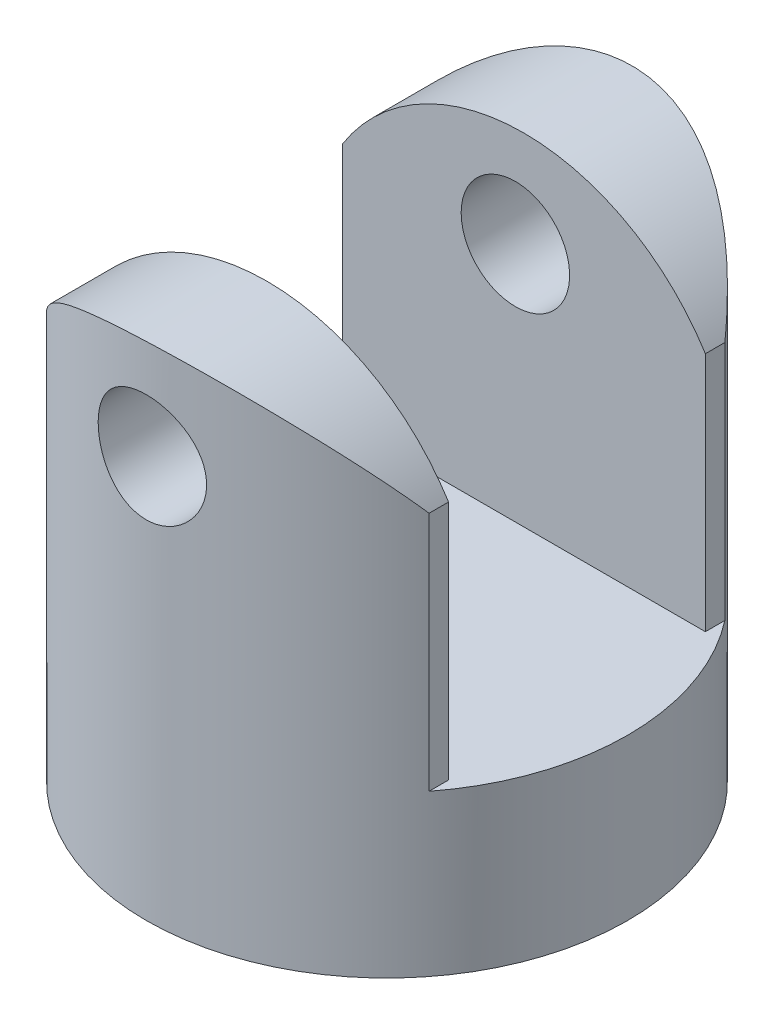
ISO-10303-21;
HEADER;
FILE_DESCRIPTION(('STEP AP214'),'2;1');
FILE_NAME('part.step','',(''),(''),'','','');
FILE_SCHEMA(('AUTOMOTIVE_DESIGN { 1 0 10303 214 1 1 1 1 }'));
ENDSEC;
DATA;
#1=APPLICATION_CONTEXT('core data for automotive mechanical design processes');
#2=APPLICATION_PROTOCOL_DEFINITION('international standard','automotive_design',2000,#1);
#3=PRODUCT_CONTEXT('',#1,'mechanical');
#4=PRODUCT('Part','Part','',(#3));
#5=PRODUCT_RELATED_PRODUCT_CATEGORY('part','',(#4));
#6=PRODUCT_DEFINITION_FORMATION('','',#4);
#7=PRODUCT_DEFINITION_CONTEXT('part definition',#1,'design');
#8=PRODUCT_DEFINITION('design','',#6,#7);
#9=PRODUCT_DEFINITION_SHAPE('','',#8);
#10=(LENGTH_UNIT() NAMED_UNIT(*) SI_UNIT(.MILLI.,.METRE.));
#11=(NAMED_UNIT(*) PLANE_ANGLE_UNIT() SI_UNIT($,.RADIAN.));
#12=(NAMED_UNIT(*) SI_UNIT($,.STERADIAN.) SOLID_ANGLE_UNIT());
#13=UNCERTAINTY_MEASURE_WITH_UNIT(LENGTH_MEASURE(1.E-05),#10,'distance_accuracy_value','');
#14=(GEOMETRIC_REPRESENTATION_CONTEXT(3) GLOBAL_UNCERTAINTY_ASSIGNED_CONTEXT((#13)) GLOBAL_UNIT_ASSIGNED_CONTEXT((#10,
#11,#12)) REPRESENTATION_CONTEXT('',''));
#15=CARTESIAN_POINT('',(0.,0.,0.));
#16=DIRECTION('',(0.,0.,1.));
#17=DIRECTION('',(1.,0.,0.));
#18=AXIS2_PLACEMENT_3D('',#15,#16,#17);
#19=CARTESIAN_POINT('',(0.528039329343625,17.9077567487408,15.001));
#20=DIRECTION('',(0.,0.,-1.));
#21=DIRECTION('',(-1.,0.,0.));
#22=AXIS2_PLACEMENT_3D('',#19,#20,#21);
#23=CYLINDRICAL_SURFACE('',#22,13.3487762951952);
#24=DIRECTION('',(0.,0.,-1.));
#25=VECTOR('',#24,1.);
#26=CARTESIAN_POINT('',(11.8368816327863,25.,15.001));
#27=LINE('',#26,#25);
#28=CARTESIAN_POINT('',(11.8368816327863,25.,9.21348105828666));
#29=VERTEX_POINT('',#28);
#30=CARTESIAN_POINT('',(11.8368816327863,25.,8.));
#31=VERTEX_POINT('',#30);
#32=EDGE_CURVE('E125',#29,#31,#27,.T.);
#33=ORIENTED_EDGE('',*,*,#32,.T.);
#34=CARTESIAN_POINT('',(0.528039329343625,17.9077567487408,8.));
#35=DIRECTION('',(0.,0.,1.));
#36=DIRECTION('',(1.,0.,0.));
#37=AXIS2_PLACEMENT_3D('',#34,#35,#36);
#38=CIRCLE('',#37,13.3487762951952);
#39=CARTESIAN_POINT('',(-10.780802974099,25.,8.));
#40=VERTEX_POINT('',#39);
#41=EDGE_CURVE('E103',#31,#40,#38,.T.);
#42=ORIENTED_EDGE('',*,*,#41,.T.);
#43=DIRECTION('',(0.,0.,-1.));
#44=VECTOR('',#43,1.);
#45=CARTESIAN_POINT('',(-10.780802974099,25.,15.001));
#46=LINE('',#45,#44);
#47=CARTESIAN_POINT('',(-10.780802974099,25.,10.4294912260214));
#48=VERTEX_POINT('',#47);
#49=EDGE_CURVE('E171',#48,#40,#46,.T.);
#50=ORIENTED_EDGE('',*,*,#49,.F.);
#51=CARTESIAN_POINT('',(-10.780802974099,25.,10.4294912260214));
#52=CARTESIAN_POINT('',(-10.6767845071352,25.1658448509809,10.5370205264883));
#53=CARTESIAN_POINT('',(-10.569250784375,25.3292215086913,10.6449505873431));
#54=CARTESIAN_POINT('',(-10.3471506208403,25.6510351177723,10.8609591182752));
#55=CARTESIAN_POINT('',(-10.2325838743859,25.8094718539845,10.9690375946031));
#56=CARTESIAN_POINT('',(-9.9962784865019,26.1215807322551,11.184813710475));
#57=CARTESIAN_POINT('',(-9.87453115137898,26.2752467400476,11.2925107137933));
#58=CARTESIAN_POINT('',(-9.62399002202851,26.5775124286,11.5067803289509));
#59=CARTESIAN_POINT('',(-9.4951963046759,26.7261121646036,11.6133529530417));
#60=CARTESIAN_POINT('',(-9.09576650427008,27.1668286317759,11.9324703400557));
#61=CARTESIAN_POINT('',(-8.81420968814826,27.4510445254302,12.1424484133839));
#62=CARTESIAN_POINT('',(-8.22227355205284,27.9965477808674,12.5508348601415));
#63=CARTESIAN_POINT('',(-7.91191015147697,28.2578476532768,12.749249526323));
#64=CARTESIAN_POINT('',(-7.33467444737729,28.6998221430216,13.0877135234709));
#65=CARTESIAN_POINT('',(-7.07348385339886,28.8855023322976,13.2309284150004));
#66=CARTESIAN_POINT('',(-6.53397927516369,29.2400953553385,13.5055064110386));
#67=CARTESIAN_POINT('',(-6.25566551931629,29.409008412685,13.636869673581));
#68=CARTESIAN_POINT('',(-5.68355007371851,29.7277752683914,13.8850330987926));
#69=CARTESIAN_POINT('',(-5.38980576608855,29.8776934639586,14.0018824391699));
#70=CARTESIAN_POINT('',(-4.78701031864825,30.1572624304877,14.2192517406707));
#71=CARTESIAN_POINT('',(-4.47796174390508,30.2869165827604,14.3197744262121));
#72=CARTESIAN_POINT('',(-3.89529815437619,30.5055789887417,14.4880565104803));
#73=CARTESIAN_POINT('',(-3.62364508973744,30.5977726044787,14.5584799118023));
#74=CARTESIAN_POINT('',(-3.0718794649517,30.7651862046356,14.6848090781585));
#75=CARTESIAN_POINT('',(-2.79176837857416,30.840409126986,14.740717356273));
#76=CARTESIAN_POINT('',(-2.22462911585881,30.9728801924106,14.8369052016296));
#77=CARTESIAN_POINT('',(-1.93759990437897,31.0301256273532,14.8771824144204));
#78=CARTESIAN_POINT('',(-1.35858023012362,31.1257970870263,14.9411877040296));
#79=CARTESIAN_POINT('',(-1.06658970956682,31.1642228924207,14.9649155879727));
#80=CARTESIAN_POINT('',(-0.478988975671641,31.2217759983902,14.9952444111689));
#81=CARTESIAN_POINT('',(-0.183370898245279,31.2408487831455,15.001797050849));
#82=CARTESIAN_POINT('',(0.408349545216138,31.2592780165218,14.9973593474302));
#83=CARTESIAN_POINT('',(0.704451911519798,31.2586344542038,14.9863689945981));
#84=CARTESIAN_POINT('',(1.29479973116863,31.2377661923697,14.946940092007));
#85=CARTESIAN_POINT('',(1.58904512767037,31.2175408963384,14.9185010107199));
#86=CARTESIAN_POINT('',(2.17342622280243,31.1579943050989,14.8446273419399));
#87=CARTESIAN_POINT('',(2.46356195823639,31.1186731810128,14.7991929067472));
#88=CARTESIAN_POINT('',(3.02478357367458,31.0239080212871,14.6945052923345));
#89=CARTESIAN_POINT('',(3.29613967222891,30.9692677462792,14.6359646902139));
#90=CARTESIAN_POINT('',(3.83171830161681,30.844184328411,14.5049625548867));
#91=CARTESIAN_POINT('',(4.09594124289516,30.7737420969823,14.4325018246056));
#92=CARTESIAN_POINT('',(4.61598899509039,30.6180739267756,14.2746797085732));
#93=CARTESIAN_POINT('',(4.8718147788861,30.5328497078517,14.1893198237612));
#94=CARTESIAN_POINT('',(5.37415909062689,30.3486794351946,14.0067795426302));
#95=CARTESIAN_POINT('',(5.62067574875886,30.2497306432253,13.9095967879672));
#96=CARTESIAN_POINT('',(6.19570459953179,29.9990649979947,13.6654484363618));
#97=CARTESIAN_POINT('',(6.51967102375743,29.8416073316556,13.5136230576946));
#98=CARTESIAN_POINT('',(7.14721522521976,29.5053074480084,13.192485238407));
#99=CARTESIAN_POINT('',(7.45078600069055,29.3264579449372,13.0231668425974));
#100=CARTESIAN_POINT('',(8.03789488995892,28.9492271588008,12.6692593883571));
#101=CARTESIAN_POINT('',(8.32136038564719,28.7507807090243,12.4846197301809));
#102=CARTESIAN_POINT('',(8.86691913162326,28.3370483599261,12.103244089889));
#103=CARTESIAN_POINT('',(9.12901482212963,28.1217643887974,11.9065094934072));
#104=CARTESIAN_POINT('',(9.62529042293177,27.6820499480548,11.5087869854472));
#105=CARTESIAN_POINT('',(9.86002949130626,27.4580181321744,11.3080535801037));
#106=CARTESIAN_POINT('',(10.3097498816387,26.996855851679,10.8996027593152));
#107=CARTESIAN_POINT('',(10.5247288829125,26.7597238537601,10.6918845274531));
#108=CARTESIAN_POINT('',(10.933400636061,26.2754192308362,10.2735318786191));
#109=CARTESIAN_POINT('',(11.127268124185,26.0283566506254,10.0629407518709));
#110=CARTESIAN_POINT('',(11.403926830263,25.6491622952341,9.74526395076662));
#111=CARTESIAN_POINT('',(11.4937735962802,25.5213558409013,9.63909365689168));
#112=CARTESIAN_POINT('',(11.6688091603659,25.2628513499736,9.42644488897973));
#113=CARTESIAN_POINT('',(11.753998113281,25.1321534097078,9.3199664253117));
#114=CARTESIAN_POINT('',(11.8368816327863,25.,9.21348105828666));
#115=B_SPLINE_CURVE_WITH_KNOTS('',3,(#51,#52,#53,#54,#55,#56,#57,#58,#59,#60,#61,#62,#63,#64,
#65,#66,#67,#68,#69,#70,#71,#72,#73,#74,#75,#76,#77,#78,#79,#80,#81,#82,#83,#84,#85,#86,#87,#88,
#89,#90,#91,#92,#93,#94,#95,#96,#97,#98,#99,#100,#101,#102,#103,#104,#105,#106,#107,#108,#109,
#110,#111,#112,#113,#114),.UNSPECIFIED.,.F.,.F.,(4,2,2,2,2,2,2,2,2,2,2,2,2,2,2,2,2,2,2,2,2,2,2,
2,2,2,2,2,2,2,2,4),(0.,0.670015073832004,1.34005928953072,2.01093209368628,2.68179758018172,
4.03561959542131,5.38869785203269,6.44080844469403,7.49290500607888,8.54133341195896,
9.58958668714896,10.4748539076447,11.3599677547617,12.245214871694,13.1304723056247,
14.0182165693011,14.9059613255205,15.7937331258195,16.6814969707356,17.5293744681712,
18.3772030739529,19.2249331026849,20.0728325088495,21.2437933031752,22.4151540522718,
23.5905502876216,24.7658121159216,25.9096393439031,27.0536007353516,28.1872288031366,
28.7538277533058,29.3204078557373),.UNSPECIFIED.);
#116=EDGE_CURVE('E129',#48,#29,#115,.T.);
#117=ORIENTED_EDGE('',*,*,#116,.T.);
#118=EDGE_LOOP('',(#33,#42,#50,#117));
#119=FACE_BOUND('',#118,.T.);
#120=ADVANCED_FACE('F33',(#119),#23,.T.);
#121=CARTESIAN_POINT('',(11.8368816327863,10.,15.001));
#122=DIRECTION('',(-1.,0.,0.));
#123=DIRECTION('',(0.,-1.,0.));
#124=AXIS2_PLACEMENT_3D('',#121,#122,#123);
#125=PLANE('',#124);
#126=DIRECTION('',(0.,0.,-1.));
#127=VECTOR('',#126,1.);
#128=CARTESIAN_POINT('',(11.8368816327863,10.,15.001));
#129=LINE('',#128,#127);
#130=CARTESIAN_POINT('',(11.8368816327863,10.,9.21348105828666));
#131=VERTEX_POINT('',#130);
#132=CARTESIAN_POINT('',(11.8368816327863,10.,8.));
#133=VERTEX_POINT('',#132);
#134=EDGE_CURVE('E115',#131,#133,#129,.T.);
#135=ORIENTED_EDGE('',*,*,#134,.T.);
#136=DIRECTION('',(0.,-1.,0.));
#137=VECTOR('',#136,1.);
#138=CARTESIAN_POINT('',(11.8368816327863,10.,8.));
#139=LINE('',#138,#137);
#140=EDGE_CURVE('E98',#31,#133,#139,.T.);
#141=ORIENTED_EDGE('',*,*,#140,.F.);
#142=ORIENTED_EDGE('',*,*,#32,.F.);
#143=DIRECTION('',(0.,-1.,0.));
#144=VECTOR('',#143,1.);
#145=CARTESIAN_POINT('',(11.8368816327863,10.,9.21348105828666));
#146=LINE('',#145,#144);
#147=EDGE_CURVE('E121',#29,#131,#146,.T.);
#148=ORIENTED_EDGE('',*,*,#147,.T.);
#149=EDGE_LOOP('',(#135,#141,#142,#148));
#150=FACE_BOUND('',#149,.T.);
#151=ADVANCED_FACE('F120',(#150),#125,.F.);
#152=CARTESIAN_POINT('',(-10.780802974099,25.,15.001));
#153=DIRECTION('',(1.,0.,0.));
#154=DIRECTION('',(0.,1.,0.));
#155=AXIS2_PLACEMENT_3D('',#152,#153,#154);
#156=PLANE('',#155);
#157=ORIENTED_EDGE('',*,*,#49,.T.);
#158=DIRECTION('',(0.,-1.,0.));
#159=VECTOR('',#158,1.);
#160=CARTESIAN_POINT('',(-10.780802974099,25.,8.));
#161=LINE('',#160,#159);
#162=CARTESIAN_POINT('',(-10.780802974099,10.,8.));
#163=VERTEX_POINT('',#162);
#164=EDGE_CURVE('E11',#40,#163,#161,.T.);
#165=ORIENTED_EDGE('',*,*,#164,.T.);
#166=DIRECTION('',(0.,0.,-1.));
#167=VECTOR('',#166,1.);
#168=CARTESIAN_POINT('',(-10.780802974099,10.,15.001));
#169=LINE('',#168,#167);
#170=CARTESIAN_POINT('',(-10.780802974099,10.,10.4294912260214));
#171=VERTEX_POINT('',#170);
#172=EDGE_CURVE('E118',#171,#163,#169,.T.);
#173=ORIENTED_EDGE('',*,*,#172,.F.);
#174=DIRECTION('',(0.,-1.,0.));
#175=VECTOR('',#174,1.);
#176=CARTESIAN_POINT('',(-10.780802974099,10.,10.4294912260214));
#177=LINE('',#176,#175);
#178=EDGE_CURVE('E181',#171,#48,#177,.F.);
#179=ORIENTED_EDGE('',*,*,#178,.T.);
#180=EDGE_LOOP('',(#157,#165,#173,#179));
#181=FACE_BOUND('',#180,.T.);
#182=ADVANCED_FACE('F156',(#181),#156,.F.);
#183=CARTESIAN_POINT('',(0.,10.,0.));
#184=DIRECTION('',(0.,-1.,0.));
#185=DIRECTION('',(0.,0.,-1.));
#186=AXIS2_PLACEMENT_3D('',#183,#184,#185);
#187=CYLINDRICAL_SURFACE('',#186,15.);
#188=CARTESIAN_POINT('',(0.,21.6218,15.));
#189=CARTESIAN_POINT('',(-0.18722261584901,21.6218061926632,14.9999965733857));
#190=CARTESIAN_POINT('',(-0.374518873466418,21.637416564532,14.9964592845321));
#191=CARTESIAN_POINT('',(-0.743781821494451,21.6993751563731,14.9826901973665));
#192=CARTESIAN_POINT('',(-0.925744769888673,21.745744443025,14.9724538109292));
#193=CARTESIAN_POINT('',(-1.27895194977318,21.8676873562788,14.9464250513782));
#194=CARTESIAN_POINT('',(-1.45020748350478,21.9432295632834,14.9306386573253));
#195=CARTESIAN_POINT('',(-1.77760906242687,22.1212720325761,14.8952091989577));
#196=CARTESIAN_POINT('',(-1.93375531651564,22.2237719220791,14.8755661879752));
#197=CARTESIAN_POINT('',(-2.22915756704326,22.4546582703453,14.8341992486776));
#198=CARTESIAN_POINT('',(-2.36812079445528,22.5834144824271,14.8124482314094));
#199=CARTESIAN_POINT('',(-2.62267254349759,22.8623651870797,14.7695054207577));
#200=CARTESIAN_POINT('',(-2.73825887928982,23.0125616821696,14.7483136798297));
#201=CARTESIAN_POINT('',(-2.94408419953252,23.3323154930972,14.7086206404562));
#202=CARTESIAN_POINT('',(-3.03400839385389,23.5020801262648,14.6901539941893));
#203=CARTESIAN_POINT('',(-3.18393660553434,23.8547965418279,14.658392137298));
#204=CARTESIAN_POINT('',(-3.24394443288159,24.0377466415947,14.6450962681985));
#205=CARTESIAN_POINT('',(-3.3313627469089,24.4084559267915,14.6254577986575));
#206=CARTESIAN_POINT('',(-3.35929322640536,24.5960864943,14.6190044138142));
#207=CARTESIAN_POINT('',(-3.38338144142819,24.9734727011663,14.6134490980053));
#208=CARTESIAN_POINT('',(-3.37954332665847,25.1632280597444,14.6143462068973));
#209=CARTESIAN_POINT('',(-3.34062105290442,25.5355885945458,14.6232903545746));
#210=CARTESIAN_POINT('',(-3.30614395696298,25.7182610716726,14.6311984740335));
#211=CARTESIAN_POINT('',(-3.20788547438465,26.0751606657584,14.6530536187186));
#212=CARTESIAN_POINT('',(-3.14410235523768,26.2493872827428,14.6670010009704));
#213=CARTESIAN_POINT('',(-2.9884929948985,26.5861404825229,14.699498180197));
#214=CARTESIAN_POINT('',(-2.89643593665485,26.7485566242541,14.7180856137085));
#215=CARTESIAN_POINT('',(-2.68705397093118,27.0558594169915,14.7577458496698));
#216=CARTESIAN_POINT('',(-2.56972542364568,27.2007435381939,14.7788190099362));
#217=CARTESIAN_POINT('',(-2.30993108011768,27.4723615659915,14.8216701675533));
#218=CARTESIAN_POINT('',(-2.16694981796153,27.5986021580887,14.8434532367945));
#219=CARTESIAN_POINT('',(-1.86159603951819,27.8253962963909,14.88482990033));
#220=CARTESIAN_POINT('',(-1.6992231298123,27.9259493213153,14.9044234501876));
#221=CARTESIAN_POINT('',(-1.35907313617883,28.0986473520062,14.9392831549936));
#222=CARTESIAN_POINT('',(-1.18126056380987,28.1707246779648,14.9545389764025));
#223=CARTESIAN_POINT('',(-0.81562679479363,28.2838381919087,14.9789279276557));
#224=CARTESIAN_POINT('',(-0.627807148055846,28.3248791719721,14.988062002686));
#225=CARTESIAN_POINT('',(-0.251719486767872,28.3740304335438,14.9990427055839));
#226=CARTESIAN_POINT('',(-0.0635437160446054,28.3828141592969,15.0010383414156));
#227=CARTESIAN_POINT('',(0.311586638442702,28.3690311935926,14.99793621955));
#228=CARTESIAN_POINT('',(0.498541309319544,28.3464667635951,14.9928389735339));
#229=CARTESIAN_POINT('',(0.863669697536408,28.2711858975532,14.9762181540894));
#230=CARTESIAN_POINT('',(1.04192058245056,28.2188254865178,14.9647705000977));
#231=CARTESIAN_POINT('',(1.38710790302087,28.0858364059441,14.9367314793572));
#232=CARTESIAN_POINT('',(1.5540433342124,28.005205230742,14.9201396566911));
#233=CARTESIAN_POINT('',(1.87462518780348,27.8165797898621,14.8832869716555));
#234=CARTESIAN_POINT('',(2.02803493397098,27.7081935189527,14.8629748448791));
#235=CARTESIAN_POINT('',(2.31473015168103,27.467647704789,14.8210341739339));
#236=CARTESIAN_POINT('',(2.448012836351,27.3354848748798,14.7994054480443));
#237=CARTESIAN_POINT('',(2.69335573617287,27.0480392056531,14.7567501954883));
#238=CARTESIAN_POINT('',(2.80494829393564,26.8923536500662,14.7357438079689));
#239=CARTESIAN_POINT('',(3.00040825253053,26.5640572527262,14.6971941254396));
#240=CARTESIAN_POINT('',(3.08427687369504,26.3914471563791,14.6796506780141));
#241=CARTESIAN_POINT('',(3.22132602670966,26.0351377555306,14.6501868912487));
#242=CARTESIAN_POINT('',(3.27468253974769,25.8515089327635,14.6382343800198));
#243=CARTESIAN_POINT('',(3.34970028236111,25.4775859437256,14.6212521536959));
#244=CARTESIAN_POINT('',(3.37136693425752,25.2872929234451,14.6162212542813));
#245=CARTESIAN_POINT('',(3.38214844323144,24.9101665052699,14.6137296592409));
#246=CARTESIAN_POINT('',(3.3720058463,24.7233550984764,14.6160962738445));
#247=CARTESIAN_POINT('',(3.32112455835749,24.3541773702238,14.6277407775603));
#248=CARTESIAN_POINT('',(3.28038627384373,24.1718109897408,14.6370185748499));
#249=CARTESIAN_POINT('',(3.16983841657152,23.8173327577512,14.6613534231819));
#250=CARTESIAN_POINT('',(3.10014309304433,23.6451836117837,14.6763877439279));
#251=CARTESIAN_POINT('',(2.93375548370848,23.3149136056195,14.7105492859058));
#252=CARTESIAN_POINT('',(2.83706019253202,23.1567943096695,14.729676962714));
#253=CARTESIAN_POINT('',(2.61698134212868,22.855425926074,14.7703812586334));
#254=CARTESIAN_POINT('',(2.49307127662499,22.7125671469265,14.7920015008092));
#255=CARTESIAN_POINT('',(2.22313937105889,22.4494272631025,14.8349685958733));
#256=CARTESIAN_POINT('',(2.07711240714207,22.3291514047437,14.856315384164));
#257=CARTESIAN_POINT('',(1.76463804882198,22.1129801766489,14.8966837490197));
#258=CARTESIAN_POINT('',(1.5979344303367,22.0174479411905,14.915668774707));
#259=CARTESIAN_POINT('',(1.25043852840235,21.8559124799864,14.9488046290882));
#260=CARTESIAN_POINT('',(1.06965787090118,21.7898851841431,14.9629593960653));
#261=CARTESIAN_POINT('',(0.740656329750685,21.7006202666097,14.982398157764));
#262=CARTESIAN_POINT('',(0.594177437956913,21.6711204800267,14.9889571106508));
#263=CARTESIAN_POINT('',(0.29848120931657,21.6317083634554,14.9977592907842));
#264=CARTESIAN_POINT('',(0.149264008534728,21.6217950628735,15.0000027318825));
#265=CARTESIAN_POINT('',(0.,21.6218,15.));
#266=B_SPLINE_CURVE_WITH_KNOTS('',3,(#188,#189,#190,#191,#192,#193,#194,#195,#196,#197,#198,
#199,#200,#201,#202,#203,#204,#205,#206,#207,#208,#209,#210,#211,#212,#213,#214,#215,#216,#217,
#218,#219,#220,#221,#222,#223,#224,#225,#226,#227,#228,#229,#230,#231,#232,#233,#234,#235,#236,
#237,#238,#239,#240,#241,#242,#243,#244,#245,#246,#247,#248,#249,#250,#251,#252,#253,#254,#255,
#256,#257,#258,#259,#260,#261,#262,#263,#264,#265),.UNSPECIFIED.,.T.,.F.,(4,2,2,2,2,2,2,2,2,2,2,
2,2,2,2,2,2,2,2,2,2,2,2,2,2,2,2,2,2,2,2,2,2,2,2,2,2,2,4),(0.,0.561121360809973,1.12262742913853,
1.68353042748556,2.24442566977688,2.81384551082104,3.38331857043353,3.95950324015089,
4.53561451131944,5.10224866120062,5.6688087968898,6.22438767670273,6.77999940539053,
7.34027323321124,7.90062781025152,8.47385283236851,9.0470894860793,9.62168050337833,
10.1961827844704,10.7586205425608,11.3210177284286,11.8768319765452,12.4326954994493,
12.9968903099693,13.5611631696461,14.1365063399856,14.7118241819083,15.2837894655053,
15.8556568710353,16.4142749675766,16.9728856423943,17.5293129537859,18.0858022258373,
18.6541919761484,19.2227136081399,19.7991583372057,20.375131940906,20.8225104477535,
21.2698667845355),.UNSPECIFIED.);
#267=CARTESIAN_POINT('',(0.,21.6218,15.));
#268=VERTEX_POINT('',#267);
#269=EDGE_CURVE('E207',#268,#268,#266,.T.);
#270=ORIENTED_EDGE('',*,*,#269,.T.);
#271=EDGE_LOOP('',(#270));
#272=FACE_BOUND('',#271,.T.);
#273=CARTESIAN_POINT('',(0.,28.3782,-15.));
#274=CARTESIAN_POINT('',(-0.18722261584901,28.3781938073367,-14.9999965733857));
#275=CARTESIAN_POINT('',(-0.374518873466417,28.3625834354679,-14.9964592845321));
#276=CARTESIAN_POINT('',(-0.743781821494451,28.3006248436269,-14.9826901973665));
#277=CARTESIAN_POINT('',(-0.925744769888672,28.254255556975,-14.9724538109292));
#278=CARTESIAN_POINT('',(-1.27895194977318,28.1323126437212,-14.9464250513782));
#279=CARTESIAN_POINT('',(-1.45020748350478,28.0567704367166,-14.9306386573253));
#280=CARTESIAN_POINT('',(-1.77760906242687,27.8787279674239,-14.8952091989577));
#281=CARTESIAN_POINT('',(-1.93375531651564,27.7762280779209,-14.8755661879752));
#282=CARTESIAN_POINT('',(-2.22915756704326,27.5453417296547,-14.8341992486776));
#283=CARTESIAN_POINT('',(-2.36812079445528,27.4165855175729,-14.8124482314094));
#284=CARTESIAN_POINT('',(-2.62267254349759,27.1376348129203,-14.7695054207577));
#285=CARTESIAN_POINT('',(-2.73825887928981,26.9874383178304,-14.7483136798297));
#286=CARTESIAN_POINT('',(-2.94408419953252,26.6676845069028,-14.7086206404562));
#287=CARTESIAN_POINT('',(-3.03400839385389,26.4979198737352,-14.6901539941893));
#288=CARTESIAN_POINT('',(-3.18393660553434,26.145203458172,-14.658392137298));
#289=CARTESIAN_POINT('',(-3.24394443288159,25.9622533584053,-14.6450962681985));
#290=CARTESIAN_POINT('',(-3.3313627469089,25.5915440732084,-14.6254577986575));
#291=CARTESIAN_POINT('',(-3.35929322640536,25.4039135057,-14.6190044138142));
#292=CARTESIAN_POINT('',(-3.38338144142819,25.0265272988336,-14.6134490980053));
#293=CARTESIAN_POINT('',(-3.37954332665847,24.8367719402556,-14.6143462068973));
#294=CARTESIAN_POINT('',(-3.34062105290442,24.4644114054542,-14.6232903545746));
#295=CARTESIAN_POINT('',(-3.30614395696298,24.2817389283274,-14.6311984740335));
#296=CARTESIAN_POINT('',(-3.20788547438465,23.9248393342416,-14.6530536187186));
#297=CARTESIAN_POINT('',(-3.14410235523768,23.7506127172572,-14.6670010009704));
#298=CARTESIAN_POINT('',(-2.9884929948985,23.4138595174771,-14.699498180197));
#299=CARTESIAN_POINT('',(-2.89643593665485,23.2514433757459,-14.7180856137085));
#300=CARTESIAN_POINT('',(-2.68705397093118,22.9441405830085,-14.7577458496698));
#301=CARTESIAN_POINT('',(-2.56972542364568,22.7992564618061,-14.7788190099362));
#302=CARTESIAN_POINT('',(-2.30993108011768,22.5276384340084,-14.8216701675533));
#303=CARTESIAN_POINT('',(-2.16694981796153,22.4013978419113,-14.8434532367945));
#304=CARTESIAN_POINT('',(-1.86159603951819,22.1746037036091,-14.88482990033));
#305=CARTESIAN_POINT('',(-1.6992231298123,22.0740506786847,-14.9044234501876));
#306=CARTESIAN_POINT('',(-1.35907313617883,21.9013526479938,-14.9392831549936));
#307=CARTESIAN_POINT('',(-1.18126056380987,21.8292753220352,-14.9545389764025));
#308=CARTESIAN_POINT('',(-0.81562679479363,21.7161618080913,-14.9789279276557));
#309=CARTESIAN_POINT('',(-0.627807148055846,21.6751208280279,-14.988062002686));
#310=CARTESIAN_POINT('',(-0.251719486767872,21.6259695664562,-14.9990427055839));
#311=CARTESIAN_POINT('',(-0.0635437160446049,21.6171858407031,-15.0010383414156));
#312=CARTESIAN_POINT('',(0.311586638442702,21.6309688064074,-14.99793621955));
#313=CARTESIAN_POINT('',(0.498541309319544,21.6535332364049,-14.9928389735339));
#314=CARTESIAN_POINT('',(0.863669697536408,21.7288141024468,-14.9762181540894));
#315=CARTESIAN_POINT('',(1.04192058245056,21.7811745134822,-14.9647705000977));
#316=CARTESIAN_POINT('',(1.38710790302087,21.9141635940559,-14.9367314793572));
#317=CARTESIAN_POINT('',(1.5540433342124,21.994794769258,-14.9201396566911));
#318=CARTESIAN_POINT('',(1.87462518780348,22.1834202101379,-14.8832869716555));
#319=CARTESIAN_POINT('',(2.02803493397098,22.2918064810473,-14.8629748448791));
#320=CARTESIAN_POINT('',(2.31473015168102,22.532352295211,-14.8210341739339));
#321=CARTESIAN_POINT('',(2.448012836351,22.6645151251202,-14.7994054480443));
#322=CARTESIAN_POINT('',(2.69335573617286,22.9519607943469,-14.7567501954883));
#323=CARTESIAN_POINT('',(2.80494829393564,23.1076463499338,-14.7357438079689));
#324=CARTESIAN_POINT('',(3.00040825253053,23.4359427472738,-14.6971941254396));
#325=CARTESIAN_POINT('',(3.08427687369504,23.6085528436209,-14.6796506780141));
#326=CARTESIAN_POINT('',(3.22132602670966,23.9648622444694,-14.6501868912487));
#327=CARTESIAN_POINT('',(3.27468253974769,24.1484910672365,-14.6382343800198));
#328=CARTESIAN_POINT('',(3.34970028236111,24.5224140562743,-14.6212521536959));
#329=CARTESIAN_POINT('',(3.37136693425752,24.7127070765549,-14.6162212542813));
#330=CARTESIAN_POINT('',(3.38214844323144,25.0898334947301,-14.6137296592409));
#331=CARTESIAN_POINT('',(3.3720058463,25.2766449015236,-14.6160962738445));
#332=CARTESIAN_POINT('',(3.32112455835749,25.6458226297762,-14.6277407775603));
#333=CARTESIAN_POINT('',(3.28038627384373,25.8281890102592,-14.6370185748499));
#334=CARTESIAN_POINT('',(3.16983841657152,26.1826672422488,-14.6613534231819));
#335=CARTESIAN_POINT('',(3.10014309304433,26.3548163882163,-14.6763877439279));
#336=CARTESIAN_POINT('',(2.93375548370848,26.6850863943805,-14.7105492859058));
#337=CARTESIAN_POINT('',(2.83706019253202,26.8432056903305,-14.729676962714));
#338=CARTESIAN_POINT('',(2.61698134212868,27.144574073926,-14.7703812586334));
#339=CARTESIAN_POINT('',(2.49307127662499,27.2874328530735,-14.7920015008092));
#340=CARTESIAN_POINT('',(2.22313937105889,27.5505727368974,-14.8349685958733));
#341=CARTESIAN_POINT('',(2.07711240714207,27.6708485952563,-14.856315384164));
#342=CARTESIAN_POINT('',(1.76463804882199,27.8870198233511,-14.8966837490197));
#343=CARTESIAN_POINT('',(1.5979344303367,27.9825520588095,-14.915668774707));
#344=CARTESIAN_POINT('',(1.25043852840235,28.1440875200136,-14.9488046290882));
#345=CARTESIAN_POINT('',(1.06965787090119,28.2101148158569,-14.9629593960653));
#346=CARTESIAN_POINT('',(0.740656329750688,28.2993797333903,-14.982398157764));
#347=CARTESIAN_POINT('',(0.594177437956913,28.3288795199733,-14.9889571106508));
#348=CARTESIAN_POINT('',(0.298481209316569,28.3682916365446,-14.9977592907842));
#349=CARTESIAN_POINT('',(0.149264008534727,28.3782049371265,-15.0000027318825));
#350=CARTESIAN_POINT('',(0.,28.3782,-15.));
#351=B_SPLINE_CURVE_WITH_KNOTS('',3,(#273,#274,#275,#276,#277,#278,#279,#280,#281,#282,#283,
#284,#285,#286,#287,#288,#289,#290,#291,#292,#293,#294,#295,#296,#297,#298,#299,#300,#301,#302,
#303,#304,#305,#306,#307,#308,#309,#310,#311,#312,#313,#314,#315,#316,#317,#318,#319,#320,#321,
#322,#323,#324,#325,#326,#327,#328,#329,#330,#331,#332,#333,#334,#335,#336,#337,#338,#339,#340,
#341,#342,#343,#344,#345,#346,#347,#348,#349,#350),.UNSPECIFIED.,.T.,.F.,(4,2,2,2,2,2,2,2,2,2,2,
2,2,2,2,2,2,2,2,2,2,2,2,2,2,2,2,2,2,2,2,2,2,2,2,2,2,2,4),(0.,0.561121360809973,1.12262742913853,
1.68353042748556,2.24442566977688,2.81384551082104,3.38331857043353,3.95950324015089,
4.53561451131944,5.10224866120062,5.6688087968898,6.22438767670272,6.77999940539053,
7.34027323321124,7.90062781025152,8.47385283236851,9.0470894860793,9.62168050337833,
10.1961827844704,10.7586205425608,11.3210177284286,11.8768319765452,12.4326954994493,
12.9968903099693,13.5611631696461,14.1365063399856,14.7118241819083,15.2837894655053,
15.8556568710353,16.4142749675766,16.9728856423943,17.5293129537859,18.0858022258373,
18.6541919761484,19.2227136081399,19.7991583372057,20.375131940906,20.8225104477535,
21.2698667845355),.UNSPECIFIED.);
#352=CARTESIAN_POINT('',(0.,28.3782,-15.));
#353=VERTEX_POINT('',#352);
#354=EDGE_CURVE('E109',#353,#353,#351,.T.);
#355=ORIENTED_EDGE('',*,*,#354,.T.);
#356=EDGE_LOOP('',(#355));
#357=FACE_BOUND('',#356,.T.);
#358=CARTESIAN_POINT('',(0.,10.,0.));
#359=DIRECTION('',(0.,1.,0.));
#360=DIRECTION('',(0.,0.,1.));
#361=AXIS2_PLACEMENT_3D('',#358,#359,#360);
#362=CIRCLE('',#361,15.);
#363=CARTESIAN_POINT('',(11.8368816327863,10.,-9.21348105828666));
#364=VERTEX_POINT('',#363);
#365=EDGE_CURVE('E137',#131,#364,#362,.T.);
#366=ORIENTED_EDGE('',*,*,#365,.F.);
#367=ORIENTED_EDGE('',*,*,#147,.F.);
#368=ORIENTED_EDGE('',*,*,#116,.F.);
#369=ORIENTED_EDGE('',*,*,#178,.F.);
#370=CARTESIAN_POINT('',(-10.780802974099,10.,-10.4294912260214));
#371=VERTEX_POINT('',#370);
#372=EDGE_CURVE('E242',#371,#171,#362,.T.);
#373=ORIENTED_EDGE('',*,*,#372,.F.);
#374=DIRECTION('',(0.,-1.,0.));
#375=VECTOR('',#374,1.);
#376=CARTESIAN_POINT('',(-10.780802974099,10.,-10.4294912260214));
#377=LINE('',#376,#375);
#378=CARTESIAN_POINT('',(-10.780802974099,25.,-10.4294912260214));
#379=VERTEX_POINT('',#378);
#380=EDGE_CURVE('E179',#371,#379,#377,.F.);
#381=ORIENTED_EDGE('',*,*,#380,.T.);
#382=CARTESIAN_POINT('',(-10.780802974099,25.,-10.4294912260214));
#383=CARTESIAN_POINT('',(-10.6767845071352,25.1658448509809,-10.5370205264883));
#384=CARTESIAN_POINT('',(-10.569250784375,25.3292215086913,-10.6449505873431));
#385=CARTESIAN_POINT('',(-10.3471506208403,25.6510351177723,-10.8609591182752));
#386=CARTESIAN_POINT('',(-10.2325838743859,25.8094718539845,-10.9690375946031));
#387=CARTESIAN_POINT('',(-9.9962784865019,26.1215807322551,-11.184813710475));
#388=CARTESIAN_POINT('',(-9.87453115137898,26.2752467400475,-11.2925107137934));
#389=CARTESIAN_POINT('',(-9.62399002202851,26.5775124286,-11.5067803289509));
#390=CARTESIAN_POINT('',(-9.4951963046759,26.7261121646036,-11.6133529530417));
#391=CARTESIAN_POINT('',(-9.09576650427008,27.1668286317759,-11.9324703400557));
#392=CARTESIAN_POINT('',(-8.81420968814826,27.4510445254302,-12.1424484133839));
#393=CARTESIAN_POINT('',(-8.22227355205284,27.9965477808674,-12.5508348601415));
#394=CARTESIAN_POINT('',(-7.91191015147697,28.2578476532768,-12.749249526323));
#395=CARTESIAN_POINT('',(-7.33467444737729,28.6998221430216,-13.0877135234709));
#396=CARTESIAN_POINT('',(-7.07348385339886,28.8855023322976,-13.2309284150004));
#397=CARTESIAN_POINT('',(-6.53397927516369,29.2400953553385,-13.5055064110386));
#398=CARTESIAN_POINT('',(-6.25566551931629,29.409008412685,-13.636869673581));
#399=CARTESIAN_POINT('',(-5.68355007371851,29.7277752683914,-13.8850330987926));
#400=CARTESIAN_POINT('',(-5.38980576608855,29.8776934639586,-14.0018824391699));
#401=CARTESIAN_POINT('',(-4.78701031864825,30.1572624304877,-14.2192517406707));
#402=CARTESIAN_POINT('',(-4.47796174390509,30.2869165827604,-14.3197744262121));
#403=CARTESIAN_POINT('',(-3.8952981543762,30.5055789887417,-14.4880565104803));
#404=CARTESIAN_POINT('',(-3.62364508973745,30.5977726044787,-14.5584799118023));
#405=CARTESIAN_POINT('',(-3.0718794649517,30.7651862046356,-14.6848090781585));
#406=CARTESIAN_POINT('',(-2.79176837857416,30.840409126986,-14.740717356273));
#407=CARTESIAN_POINT('',(-2.22462911585881,30.9728801924106,-14.8369052016296));
#408=CARTESIAN_POINT('',(-1.93759990437898,31.0301256273532,-14.8771824144204));
#409=CARTESIAN_POINT('',(-1.35858023012362,31.1257970870263,-14.9411877040296));
#410=CARTESIAN_POINT('',(-1.06658970956682,31.1642228924207,-14.9649155879727));
#411=CARTESIAN_POINT('',(-0.478988975671643,31.2217759983902,-14.9952444111689));
#412=CARTESIAN_POINT('',(-0.183370898245282,31.2408487831455,-15.001797050849));
#413=CARTESIAN_POINT('',(0.408349545216137,31.2592780165218,-14.9973593474302));
#414=CARTESIAN_POINT('',(0.704451911519798,31.2586344542038,-14.9863689945981));
#415=CARTESIAN_POINT('',(1.29479973116863,31.2377661923697,-14.946940092007));
#416=CARTESIAN_POINT('',(1.58904512767037,31.2175408963384,-14.9185010107199));
#417=CARTESIAN_POINT('',(2.17342622280243,31.1579943050989,-14.8446273419399));
#418=CARTESIAN_POINT('',(2.4635619582364,31.1186731810128,-14.7991929067472));
#419=CARTESIAN_POINT('',(3.02478357367458,31.0239080212871,-14.6945052923345));
#420=CARTESIAN_POINT('',(3.29613967222891,30.9692677462792,-14.6359646902139));
#421=CARTESIAN_POINT('',(3.83171830161681,30.844184328411,-14.5049625548867));
#422=CARTESIAN_POINT('',(4.09594124289516,30.7737420969823,-14.4325018246056));
#423=CARTESIAN_POINT('',(4.61598899509039,30.6180739267756,-14.2746797085732));
#424=CARTESIAN_POINT('',(4.87181477888611,30.5328497078517,-14.1893198237612));
#425=CARTESIAN_POINT('',(5.37415909062689,30.3486794351946,-14.0067795426302));
#426=CARTESIAN_POINT('',(5.62067574875886,30.2497306432253,-13.9095967879672));
#427=CARTESIAN_POINT('',(6.1957045995318,29.9990649979947,-13.6654484363618));
#428=CARTESIAN_POINT('',(6.51967102375743,29.8416073316556,-13.5136230576946));
#429=CARTESIAN_POINT('',(7.14721522521977,29.5053074480084,-13.192485238407));
#430=CARTESIAN_POINT('',(7.45078600069055,29.3264579449372,-13.0231668425974));
#431=CARTESIAN_POINT('',(8.03789488995892,28.9492271588008,-12.6692593883571));
#432=CARTESIAN_POINT('',(8.32136038564719,28.7507807090243,-12.4846197301809));
#433=CARTESIAN_POINT('',(8.86691913162326,28.3370483599261,-12.103244089889));
#434=CARTESIAN_POINT('',(9.12901482212964,28.1217643887974,-11.9065094934072));
#435=CARTESIAN_POINT('',(9.62529042293178,27.6820499480548,-11.5087869854472));
#436=CARTESIAN_POINT('',(9.86002949130627,27.4580181321744,-11.3080535801037));
#437=CARTESIAN_POINT('',(10.3097498816387,26.996855851679,-10.8996027593152));
#438=CARTESIAN_POINT('',(10.5247288829125,26.7597238537601,-10.6918845274531));
#439=CARTESIAN_POINT('',(10.933400636061,26.2754192308362,-10.2735318786191));
#440=CARTESIAN_POINT('',(11.127268124185,26.0283566506255,-10.0629407518709));
#441=CARTESIAN_POINT('',(11.403926830263,25.6491622952341,-9.74526395076663));
#442=CARTESIAN_POINT('',(11.4937735962802,25.5213558409013,-9.63909365689169));
#443=CARTESIAN_POINT('',(11.6688091603659,25.2628513499736,-9.42644488897973));
#444=CARTESIAN_POINT('',(11.753998113281,25.1321534097078,-9.31996642531171));
#445=CARTESIAN_POINT('',(11.8368816327863,25.,-9.21348105828666));
#446=B_SPLINE_CURVE_WITH_KNOTS('',3,(#382,#383,#384,#385,#386,#387,#388,#389,#390,#391,#392,
#393,#394,#395,#396,#397,#398,#399,#400,#401,#402,#403,#404,#405,#406,#407,#408,#409,#410,#411,
#412,#413,#414,#415,#416,#417,#418,#419,#420,#421,#422,#423,#424,#425,#426,#427,#428,#429,#430,
#431,#432,#433,#434,#435,#436,#437,#438,#439,#440,#441,#442,#443,#444,#445),.UNSPECIFIED.,.F.,
.F.,(4,2,2,2,2,2,2,2,2,2,2,2,2,2,2,2,2,2,2,2,2,2,2,2,2,2,2,2,2,2,2,4),(0.,0.670015073832007,
1.34005928953072,2.01093209368628,2.68179758018172,4.03561959542132,5.3886978520327,
6.44080844469404,7.49290500607888,8.54133341195895,9.58958668714896,10.4748539076447,
11.3599677547617,12.245214871694,13.1304723056247,14.0182165693011,14.9059613255205,
15.7937331258195,16.6814969707356,17.5293744681712,18.3772030739529,19.2249331026849,
20.0728325088495,21.2437933031752,22.4151540522718,23.5905502876216,24.7658121159216,
25.9096393439032,27.0536007353516,28.1872288031366,28.7538277533058,29.3204078557373),.UNSPECIFIED.);
#447=CARTESIAN_POINT('',(11.8368816327863,25.,-9.21348105828666));
#448=VERTEX_POINT('',#447);
#449=EDGE_CURVE('E187',#379,#448,#446,.T.);
#450=ORIENTED_EDGE('',*,*,#449,.T.);
#451=DIRECTION('',(0.,-1.,0.));
#452=VECTOR('',#451,1.);
#453=CARTESIAN_POINT('',(11.8368816327863,10.,-9.21348105828666));
#454=LINE('',#453,#452);
#455=EDGE_CURVE('E193',#448,#364,#454,.T.);
#456=ORIENTED_EDGE('',*,*,#455,.T.);
#457=EDGE_LOOP('',(#366,#367,#368,#369,#373,#381,#450,#456));
#458=FACE_BOUND('',#457,.T.);
#459=CARTESIAN_POINT('',(0.,0.,0.));
#460=DIRECTION('',(0.,1.,0.));
#461=DIRECTION('',(0.,0.,1.));
#462=AXIS2_PLACEMENT_3D('',#459,#460,#461);
#463=CIRCLE('',#462,15.);
#464=CARTESIAN_POINT('',(0.,0.,15.));
#465=VERTEX_POINT('',#464);
#466=EDGE_CURVE('E183',#465,#465,#463,.T.);
#467=ORIENTED_EDGE('',*,*,#466,.T.);
#468=EDGE_LOOP('',(#467));
#469=FACE_BOUND('',#468,.T.);
#470=ADVANCED_FACE('F35',(#272,#357,#458,#469),#187,.T.);
#471=CARTESIAN_POINT('',(0.,10.,0.));
#472=DIRECTION('',(0.,1.,0.));
#473=DIRECTION('',(0.,0.,1.));
#474=AXIS2_PLACEMENT_3D('',#471,#472,#473);
#475=PLANE('',#474);
#476=ORIENTED_EDGE('',*,*,#134,.F.);
#477=ORIENTED_EDGE('',*,*,#365,.T.);
#478=CARTESIAN_POINT('',(11.8368816327863,10.,-8.));
#479=VERTEX_POINT('',#478);
#480=EDGE_CURVE('E122',#479,#364,#129,.T.);
#481=ORIENTED_EDGE('',*,*,#480,.F.);
#482=DIRECTION('',(1.,0.,0.));
#483=VECTOR('',#482,1.);
#484=CARTESIAN_POINT('',(-15.,10.,-8.));
#485=LINE('',#484,#483);
#486=CARTESIAN_POINT('',(-10.780802974099,10.,-7.99999999999999));
#487=VERTEX_POINT('',#486);
#488=EDGE_CURVE('E50',#487,#479,#485,.T.);
#489=ORIENTED_EDGE('',*,*,#488,.F.);
#490=EDGE_CURVE('E55',#487,#371,#169,.T.);
#491=ORIENTED_EDGE('',*,*,#490,.T.);
#492=ORIENTED_EDGE('',*,*,#372,.T.);
#493=ORIENTED_EDGE('',*,*,#172,.T.);
#494=DIRECTION('',(1.,0.,0.));
#495=VECTOR('',#494,1.);
#496=CARTESIAN_POINT('',(-15.,10.,8.));
#497=LINE('',#496,#495);
#498=EDGE_CURVE('E101',#163,#133,#497,.T.);
#499=ORIENTED_EDGE('',*,*,#498,.T.);
#500=EDGE_LOOP('',(#476,#477,#481,#489,#491,#492,#493,#499));
#501=FACE_BOUND('',#500,.T.);
#502=ADVANCED_FACE('F113',(#501),#475,.T.);
#503=CARTESIAN_POINT('',(0.,0.,0.));
#504=DIRECTION('',(0.,1.,0.));
#505=DIRECTION('',(0.,0.,1.));
#506=AXIS2_PLACEMENT_3D('',#503,#504,#505);
#507=PLANE('',#506);
#508=ORIENTED_EDGE('',*,*,#466,.F.);
#509=EDGE_LOOP('',(#508));
#510=FACE_BOUND('',#509,.T.);
#511=ADVANCED_FACE('F145',(#510),#507,.F.);
#512=CARTESIAN_POINT('',(-10.780802974099,25.,-8.));
#513=VERTEX_POINT('',#512);
#514=EDGE_CURVE('E176',#513,#379,#46,.T.);
#515=ORIENTED_EDGE('',*,*,#514,.F.);
#516=CARTESIAN_POINT('',(0.528039329343625,17.9077567487408,-8.));
#517=DIRECTION('',(0.,0.,-1.));
#518=DIRECTION('',(-1.,0.,0.));
#519=AXIS2_PLACEMENT_3D('',#516,#517,#518);
#520=CIRCLE('',#519,13.3487762951952);
#521=CARTESIAN_POINT('',(11.8368816327863,25.,-8.));
#522=VERTEX_POINT('',#521);
#523=EDGE_CURVE('E197',#513,#522,#520,.T.);
#524=ORIENTED_EDGE('',*,*,#523,.T.);
#525=EDGE_CURVE('E170',#522,#448,#27,.T.);
#526=ORIENTED_EDGE('',*,*,#525,.T.);
#527=ORIENTED_EDGE('',*,*,#449,.F.);
#528=EDGE_LOOP('',(#515,#524,#526,#527));
#529=FACE_BOUND('',#528,.T.);
#530=ADVANCED_FACE('F139',(#529),#23,.T.);
#531=ORIENTED_EDGE('',*,*,#525,.F.);
#532=DIRECTION('',(0.,1.,0.));
#533=VECTOR('',#532,1.);
#534=CARTESIAN_POINT('',(11.8368816327863,10.,-8.));
#535=LINE('',#534,#533);
#536=EDGE_CURVE('E108',#479,#522,#535,.T.);
#537=ORIENTED_EDGE('',*,*,#536,.F.);
#538=ORIENTED_EDGE('',*,*,#480,.T.);
#539=ORIENTED_EDGE('',*,*,#455,.F.);
#540=EDGE_LOOP('',(#531,#537,#538,#539));
#541=FACE_BOUND('',#540,.T.);
#542=ADVANCED_FACE('F144',(#541),#125,.F.);
#543=ORIENTED_EDGE('',*,*,#490,.F.);
#544=DIRECTION('',(0.,1.,0.));
#545=VECTOR('',#544,1.);
#546=CARTESIAN_POINT('',(-10.780802974099,25.,-8.));
#547=LINE('',#546,#545);
#548=EDGE_CURVE('E43',#487,#513,#547,.T.);
#549=ORIENTED_EDGE('',*,*,#548,.T.);
#550=ORIENTED_EDGE('',*,*,#514,.T.);
#551=ORIENTED_EDGE('',*,*,#380,.F.);
#552=EDGE_LOOP('',(#543,#549,#550,#551));
#553=FACE_BOUND('',#552,.T.);
#554=ADVANCED_FACE('F151',(#553),#156,.F.);
#555=CARTESIAN_POINT('',(-15.,10.,8.));
#556=DIRECTION('',(0.,0.,1.));
#557=DIRECTION('',(1.,0.,0.));
#558=AXIS2_PLACEMENT_3D('',#555,#556,#557);
#559=PLANE('',#558);
#560=CARTESIAN_POINT('',(0.,25.,8.));
#561=DIRECTION('',(0.,0.,1.));
#562=DIRECTION('',(1.,0.,0.));
#563=AXIS2_PLACEMENT_3D('',#560,#561,#562);
#564=CIRCLE('',#563,3.37819999999998);
#565=CARTESIAN_POINT('',(3.3781999999999,25.,8.));
#566=VERTEX_POINT('',#565);
#567=EDGE_CURVE('E229',#566,#566,#564,.T.);
#568=ORIENTED_EDGE('',*,*,#567,.T.);
#569=EDGE_LOOP('',(#568));
#570=FACE_BOUND('',#569,.T.);
#571=ORIENTED_EDGE('',*,*,#140,.T.);
#572=ORIENTED_EDGE('',*,*,#498,.F.);
#573=ORIENTED_EDGE('',*,*,#164,.F.);
#574=ORIENTED_EDGE('',*,*,#41,.F.);
#575=EDGE_LOOP('',(#571,#572,#573,#574));
#576=FACE_BOUND('',#575,.T.);
#577=ADVANCED_FACE('F100',(#570,#576),#559,.F.);
#578=CARTESIAN_POINT('',(-15.,10.,-8.));
#579=DIRECTION('',(0.,0.,-1.));
#580=DIRECTION('',(-1.,0.,0.));
#581=AXIS2_PLACEMENT_3D('',#578,#579,#580);
#582=PLANE('',#581);
#583=CARTESIAN_POINT('',(0.,25.,-8.));
#584=DIRECTION('',(0.,0.,-1.));
#585=DIRECTION('',(-1.,0.,0.));
#586=AXIS2_PLACEMENT_3D('',#583,#584,#585);
#587=CIRCLE('',#586,3.37819999999998);
#588=CARTESIAN_POINT('',(-3.37820000000007,25.,-8.));
#589=VERTEX_POINT('',#588);
#590=EDGE_CURVE('E38',#589,#589,#587,.T.);
#591=ORIENTED_EDGE('',*,*,#590,.T.);
#592=EDGE_LOOP('',(#591));
#593=FACE_BOUND('',#592,.T.);
#594=ORIENTED_EDGE('',*,*,#548,.F.);
#595=ORIENTED_EDGE('',*,*,#488,.T.);
#596=ORIENTED_EDGE('',*,*,#536,.T.);
#597=ORIENTED_EDGE('',*,*,#523,.F.);
#598=EDGE_LOOP('',(#594,#595,#596,#597));
#599=FACE_BOUND('',#598,.T.);
#600=ADVANCED_FACE('F217',(#593,#599),#582,.F.);
#601=CARTESIAN_POINT('',(0.,25.,15.));
#602=DIRECTION('',(0.,0.,-1.));
#603=DIRECTION('',(-1.,0.,0.));
#604=AXIS2_PLACEMENT_3D('',#601,#602,#603);
#605=CYLINDRICAL_SURFACE('',#604,3.37819999999998);
#606=ORIENTED_EDGE('',*,*,#590,.F.);
#607=EDGE_LOOP('',(#606));
#608=FACE_BOUND('',#607,.T.);
#609=ORIENTED_EDGE('',*,*,#354,.F.);
#610=EDGE_LOOP('',(#609));
#611=FACE_BOUND('',#610,.T.);
#612=ADVANCED_FACE('F212',(#608,#611),#605,.F.);
#613=ORIENTED_EDGE('',*,*,#567,.F.);
#614=EDGE_LOOP('',(#613));
#615=FACE_BOUND('',#614,.T.);
#616=ORIENTED_EDGE('',*,*,#269,.F.);
#617=EDGE_LOOP('',(#616));
#618=FACE_BOUND('',#617,.T.);
#619=ADVANCED_FACE('F216',(#615,#618),#605,.F.);
#620=CLOSED_SHELL('',(#120,#151,#182,#470,#502,#511,#530,#542,#554,#577,#600,#612,#619));
#621=MANIFOLD_SOLID_BREP('B2',#620);
#622=ADVANCED_BREP_SHAPE_REPRESENTATION('',(#18,#621),#14);
#623=SHAPE_DEFINITION_REPRESENTATION(#9,#622);
ENDSEC;
END-ISO-10303-21;
